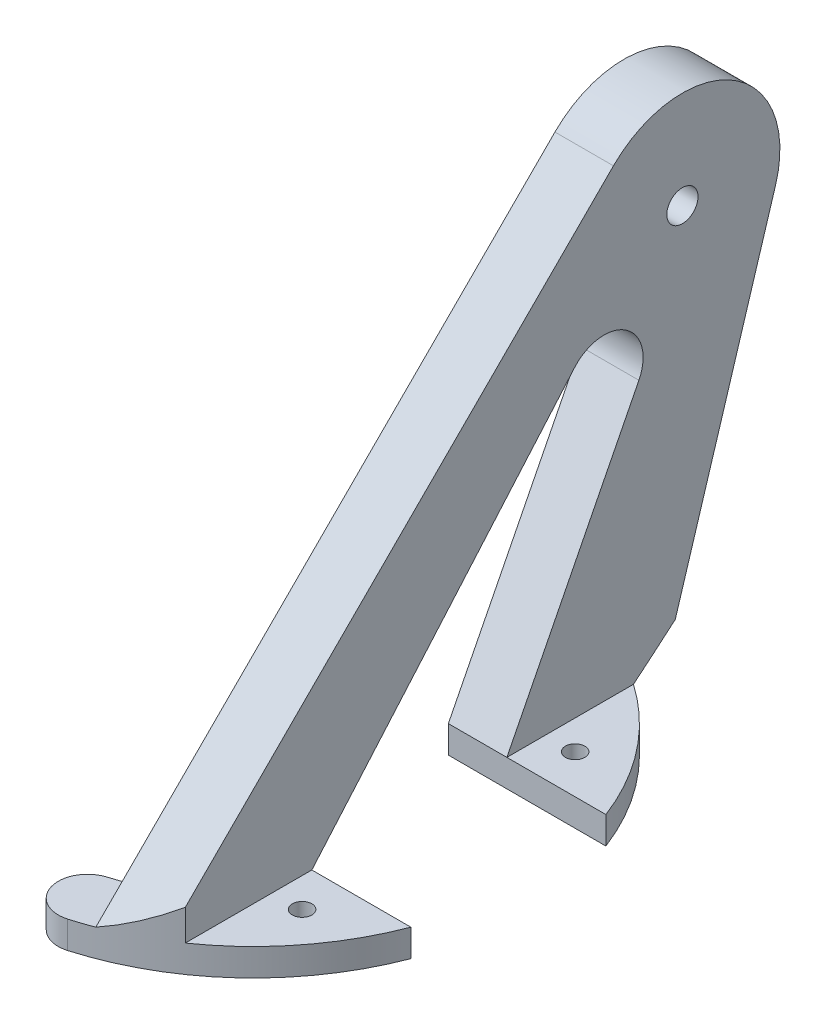
ISO-10303-21;
HEADER;
FILE_DESCRIPTION(('STEP AP214'),'2;1');
FILE_NAME('part.step','',(''),(''),'','','');
FILE_SCHEMA(('AUTOMOTIVE_DESIGN { 1 0 10303 214 1 1 1 1 }'));
ENDSEC;
DATA;
#1=APPLICATION_CONTEXT('core data for automotive mechanical design processes');
#2=APPLICATION_PROTOCOL_DEFINITION('international standard','automotive_design',2000,#1);
#3=PRODUCT_CONTEXT('',#1,'mechanical');
#4=PRODUCT('Part','Part','',(#3));
#5=PRODUCT_RELATED_PRODUCT_CATEGORY('part','',(#4));
#6=PRODUCT_DEFINITION_FORMATION('','',#4);
#7=PRODUCT_DEFINITION_CONTEXT('part definition',#1,'design');
#8=PRODUCT_DEFINITION('design','',#6,#7);
#9=PRODUCT_DEFINITION_SHAPE('','',#8);
#10=(LENGTH_UNIT() NAMED_UNIT(*) SI_UNIT(.MILLI.,.METRE.));
#11=(NAMED_UNIT(*) PLANE_ANGLE_UNIT() SI_UNIT($,.RADIAN.));
#12=(NAMED_UNIT(*) SI_UNIT($,.STERADIAN.) SOLID_ANGLE_UNIT());
#13=UNCERTAINTY_MEASURE_WITH_UNIT(LENGTH_MEASURE(1.E-05),#10,'distance_accuracy_value','');
#14=(GEOMETRIC_REPRESENTATION_CONTEXT(3) GLOBAL_UNCERTAINTY_ASSIGNED_CONTEXT((#13)) GLOBAL_UNIT_ASSIGNED_CONTEXT((#10,
#11,#12)) REPRESENTATION_CONTEXT('',''));
#15=CARTESIAN_POINT('',(0.,0.,0.));
#16=DIRECTION('',(0.,0.,1.));
#17=DIRECTION('',(1.,0.,0.));
#18=AXIS2_PLACEMENT_3D('',#15,#16,#17);
#19=CARTESIAN_POINT('',(25.,-7.,0.));
#20=DIRECTION('',(-1.,0.,0.));
#21=DIRECTION('',(0.,0.,1.));
#22=AXIS2_PLACEMENT_3D('',#19,#20,#21);
#23=PLANE('',#22);
#24=CARTESIAN_POINT('',(25.,100.,-70.));
#25=DIRECTION('',(-1.,0.,0.));
#26=DIRECTION('',(0.,0.,1.));
#27=AXIS2_PLACEMENT_3D('',#24,#25,#26);
#28=CIRCLE('',#27,11.);
#29=CARTESIAN_POINT('',(25.,100.,-59.));
#30=VERTEX_POINT('',#29);
#31=EDGE_CURVE('E205',#30,#30,#28,.T.);
#32=ORIENTED_EDGE('',*,*,#31,.F.);
#33=EDGE_LOOP('',(#32));
#34=FACE_BOUND('',#33,.T.);
#35=DIRECTION('',(0.,0.,1.));
#36=VECTOR('',#35,1.);
#37=CARTESIAN_POINT('',(25.,-7.,0.));
#38=LINE('',#37,#36);
#39=CARTESIAN_POINT('',(25.,-7.,25.));
#40=VERTEX_POINT('',#39);
#41=CARTESIAN_POINT('',(25.,-7.,48.9897948556636));
#42=VERTEX_POINT('',#41);
#43=EDGE_CURVE('E68',#40,#42,#38,.T.);
#44=ORIENTED_EDGE('',*,*,#43,.T.);
#45=DIRECTION('',(0.,1.,0.));
#46=VECTOR('',#45,1.);
#47=CARTESIAN_POINT('',(25.,-7.,48.9897948556636));
#48=LINE('',#47,#46);
#49=CARTESIAN_POINT('',(25.,0.,48.9897948556636));
#50=VERTEX_POINT('',#49);
#51=EDGE_CURVE('E63',#42,#50,#48,.T.);
#52=ORIENTED_EDGE('',*,*,#51,.T.);
#53=DIRECTION('',(0.,0.,-1.));
#54=VECTOR('',#53,1.);
#55=CARTESIAN_POINT('',(25.,0.,0.));
#56=LINE('',#55,#54);
#57=CARTESIAN_POINT('',(25.,0.,65.3834841531101));
#58=VERTEX_POINT('',#57);
#59=EDGE_CURVE('E197',#58,#50,#56,.T.);
#60=ORIENTED_EDGE('',*,*,#59,.F.);
#61=DIRECTION('',(0.,0.707022227260877,-0.707191325002696));
#62=VECTOR('',#61,1.);
#63=CARTESIAN_POINT('',(25.,0.,65.3834841531101));
#64=LINE('',#63,#62);
#65=CARTESIAN_POINT('',(25.,117.679783125067,-52.3244443184781));
#66=VERTEX_POINT('',#65);
#67=EDGE_CURVE('E294',#58,#66,#64,.T.);
#68=ORIENTED_EDGE('',*,*,#67,.T.);
#69=CARTESIAN_POINT('',(25.,100.,-70.));
#70=DIRECTION('',(-1.,0.,0.));
#71=DIRECTION('',(0.,0.,1.));
#72=AXIS2_PLACEMENT_3D('',#69,#70,#71);
#73=CIRCLE('',#72,25.);
#74=CARTESIAN_POINT('',(25.,92.6469210155402,-93.8941881939583));
#75=VERTEX_POINT('',#74);
#76=EDGE_CURVE('E298',#66,#75,#73,.T.);
#77=ORIENTED_EDGE('',*,*,#76,.T.);
#78=DIRECTION('',(0.,-0.955767527758332,0.294123159378391));
#79=VECTOR('',#78,1.);
#80=CARTESIAN_POINT('',(25.,0.,-65.3834841531101));
#81=LINE('',#80,#79);
#82=CARTESIAN_POINT('',(25.,-1.75207071073658E-13,-65.3834841531101));
#83=VERTEX_POINT('',#82);
#84=EDGE_CURVE('E260',#75,#83,#81,.T.);
#85=ORIENTED_EDGE('',*,*,#84,.T.);
#86=DIRECTION('',(0.,1.,0.));
#87=VECTOR('',#86,1.);
#88=CARTESIAN_POINT('',(25.,-7.,-65.3834841531101));
#89=LINE('',#88,#87);
#90=CARTESIAN_POINT('',(25.,-7.,-65.3834841531101));
#91=VERTEX_POINT('',#90);
#92=EDGE_CURVE('E345',#91,#83,#89,.T.);
#93=ORIENTED_EDGE('',*,*,#92,.F.);
#94=DIRECTION('',(0.,0.,1.));
#95=VECTOR('',#94,1.);
#96=CARTESIAN_POINT('',(25.,-7.,0.));
#97=LINE('',#96,#95);
#98=CARTESIAN_POINT('',(25.,-7.,-25.));
#99=VERTEX_POINT('',#98);
#100=EDGE_CURVE('E328',#91,#99,#97,.T.);
#101=ORIENTED_EDGE('',*,*,#100,.T.);
#102=DIRECTION('',(0.,1.,0.));
#103=VECTOR('',#102,1.);
#104=CARTESIAN_POINT('',(25.,-7.,-25.));
#105=LINE('',#104,#103);
#106=CARTESIAN_POINT('',(25.,0.,-25.));
#107=VERTEX_POINT('',#106);
#108=EDGE_CURVE('E340',#99,#107,#105,.T.);
#109=ORIENTED_EDGE('',*,*,#108,.T.);
#110=DIRECTION('',(0.,0.892034824715251,-0.451966670779198));
#111=VECTOR('',#110,1.);
#112=CARTESIAN_POINT('',(25.,0.,-25.));
#113=LINE('',#112,#111);
#114=CARTESIAN_POINT('',(25.,66.8072160740416,-58.849166194436));
#115=VERTEX_POINT('',#114);
#116=EDGE_CURVE('E251',#107,#115,#113,.T.);
#117=ORIENTED_EDGE('',*,*,#116,.T.);
#118=CARTESIAN_POINT('',(25.,71.3268827818336,-49.9288179472835));
#119=DIRECTION('',(1.,0.,0.));
#120=DIRECTION('',(0.,0.,1.));
#121=AXIS2_PLACEMENT_3D('',#118,#119,#120);
#122=CIRCLE('',#121,9.99999999999999);
#123=CARTESIAN_POINT('',(25.,77.8694877769299,-42.3661253131657));
#124=VERTEX_POINT('',#123);
#125=EDGE_CURVE('E286',#115,#124,#122,.T.);
#126=ORIENTED_EDGE('',*,*,#125,.T.);
#127=DIRECTION('',(0.,-0.756269263411783,0.654260499509636));
#128=VECTOR('',#127,1.);
#129=CARTESIAN_POINT('',(25.,0.,25.));
#130=LINE('',#129,#128);
#131=CARTESIAN_POINT('',(25.,0.,25.));
#132=VERTEX_POINT('',#131);
#133=EDGE_CURVE('E290',#124,#132,#130,.T.);
#134=ORIENTED_EDGE('',*,*,#133,.T.);
#135=DIRECTION('',(0.,1.,0.));
#136=VECTOR('',#135,1.);
#137=CARTESIAN_POINT('',(25.,-7.,25.));
#138=LINE('',#137,#136);
#139=EDGE_CURVE('E247',#40,#132,#138,.T.);
#140=ORIENTED_EDGE('',*,*,#139,.F.);
#141=EDGE_LOOP('',(#44,#52,#60,#68,#77,#85,#93,#101,#109,#117,#126,#134,#140));
#142=FACE_BOUND('',#141,.T.);
#143=ADVANCED_FACE('F43',(#34,#142),#23,.T.);
#144=CARTESIAN_POINT('',(65.3834841531101,100.,-70.));
#145=DIRECTION('',(-1.,0.,0.));
#146=DIRECTION('',(0.,0.,1.));
#147=AXIS2_PLACEMENT_3D('',#144,#145,#146);
#148=CYLINDRICAL_SURFACE('',#147,4.00000000000001);
#149=CARTESIAN_POINT('',(40.,100.,-70.));
#150=DIRECTION('',(-1.,0.,0.));
#151=DIRECTION('',(0.,0.,1.));
#152=AXIS2_PLACEMENT_3D('',#149,#150,#151);
#153=CIRCLE('',#152,4.00000000000001);
#154=CARTESIAN_POINT('',(40.,100.,-66.));
#155=VERTEX_POINT('',#154);
#156=EDGE_CURVE('E228',#155,#155,#153,.T.);
#157=ORIENTED_EDGE('',*,*,#156,.F.);
#158=EDGE_LOOP('',(#157));
#159=FACE_BOUND('',#158,.T.);
#160=CARTESIAN_POINT('',(30.,100.,-70.));
#161=DIRECTION('',(-1.,0.,0.));
#162=DIRECTION('',(0.,0.,1.));
#163=AXIS2_PLACEMENT_3D('',#160,#161,#162);
#164=CIRCLE('',#163,4.00000000000001);
#165=CARTESIAN_POINT('',(30.,100.,-66.));
#166=VERTEX_POINT('',#165);
#167=EDGE_CURVE('E49',#166,#166,#164,.F.);
#168=ORIENTED_EDGE('',*,*,#167,.F.);
#169=EDGE_LOOP('',(#168));
#170=FACE_BOUND('',#169,.T.);
#171=ADVANCED_FACE('F375',(#159,#170),#148,.F.);
#172=CARTESIAN_POINT('',(40.,0.,-65.3834841531101));
#173=DIRECTION('',(0.,-0.294123159378391,-0.955767527758332));
#174=DIRECTION('',(0.,0.955767527758332,-0.294123159378391));
#175=AXIS2_PLACEMENT_3D('',#172,#173,#174);
#176=PLANE('',#175);
#177=DIRECTION('',(0.,-0.955767527758332,0.294123159378391));
#178=VECTOR('',#177,1.);
#179=CARTESIAN_POINT('',(40.,0.,-65.3834841531101));
#180=LINE('',#179,#178);
#181=CARTESIAN_POINT('',(40.,92.6469210155402,-93.8941881939583));
#182=VERTEX_POINT('',#181);
#183=CARTESIAN_POINT('',(40.,9.03312240627647,-68.1632924475153));
#184=VERTEX_POINT('',#183);
#185=EDGE_CURVE('E279',#182,#184,#180,.T.);
#186=ORIENTED_EDGE('',*,*,#185,.T.);
#187=CARTESIAN_POINT('',(40.,9.03312240627647,-68.1632924475153));
#188=CARTESIAN_POINT('',(39.3987699086919,8.61889922566565,-68.0358214600308));
#189=CARTESIAN_POINT('',(38.7949177006889,8.20816896502699,-67.9094253664172));
#190=CARTESIAN_POINT('',(37.5815302389742,7.39440143029424,-67.65900058072));
#191=CARTESIAN_POINT('',(36.9719947514653,6.99136447478207,-67.5349719866753));
#192=CARTESIAN_POINT('',(35.1358387636793,5.79592022739036,-67.1670919021444));
#193=CARTESIAN_POINT('',(33.9001407886153,5.01612176308195,-66.9271205897284));
#194=CARTESIAN_POINT('',(32.0283979672395,3.87877927593322,-66.5771204527704));
#195=CARTESIAN_POINT('',(31.4026346895246,3.5057233080642,-66.4623180591884));
#196=CARTESIAN_POINT('',(30.1438594298698,2.7709649856057,-66.2362071766729));
#197=CARTESIAN_POINT('',(29.5108476374584,2.40926233507971,-66.1248985966694));
#198=CARTESIAN_POINT('',(28.2363577982883,1.69799845965656,-65.9060177787766));
#199=CARTESIAN_POINT('',(27.5948704286521,1.34845246578285,-65.7984502280068));
#200=CARTESIAN_POINT('',(26.3036854183782,0.663358778792782,-65.5876228941254));
#201=CARTESIAN_POINT('',(25.653986947649,0.327812515951839,-65.4843635511596));
#202=CARTESIAN_POINT('',(25.,-2.71636636580298E-13,-65.38348415311));
#203=B_SPLINE_CURVE_WITH_KNOTS('',3,(#187,#188,#189,#190,#191,#192,#193,#194,#195,#196,#197,
#198,#199,#200,#201,#202),.UNSPECIFIED.,.F.,.F.,(4,2,2,2,2,2,2,4),(0.,2.22341819047516,
4.44692825444808,8.8882901313285,11.1007356438604,13.3131234386312,15.5281899782592,
17.7434822676495),.UNSPECIFIED.);
#204=EDGE_CURVE('E55',#184,#83,#203,.T.);
#205=ORIENTED_EDGE('',*,*,#204,.T.);
#206=ORIENTED_EDGE('',*,*,#84,.F.);
#207=DIRECTION('',(-1.,0.,0.));
#208=VECTOR('',#207,1.);
#209=CARTESIAN_POINT('',(40.,92.6469210155402,-93.8941881939583));
#210=LINE('',#209,#208);
#211=EDGE_CURVE('E304',#182,#75,#210,.T.);
#212=ORIENTED_EDGE('',*,*,#211,.F.);
#213=EDGE_LOOP('',(#186,#205,#206,#212));
#214=FACE_BOUND('',#213,.T.);
#215=ADVANCED_FACE('F370',(#214),#176,.T.);
#216=CARTESIAN_POINT('',(40.,0.,65.3834841531101));
#217=DIRECTION('',(0.,0.707191325002696,0.707022227260877));
#218=DIRECTION('',(0.,-0.707022227260877,0.707191325002696));
#219=AXIS2_PLACEMENT_3D('',#216,#217,#218);
#220=PLANE('',#219);
#221=CARTESIAN_POINT('',(0.,65.3678501950402,0.));
#222=DIRECTION('',(0.,0.707191325002696,0.707022227260877));
#223=DIRECTION('',(0.,-0.707022227260877,0.707191325002696));
#224=AXIS2_PLACEMENT_3D('',#221,#222,#223);
#225=ELLIPSE('',#224,98.9831146468506,70.);
#226=CARTESIAN_POINT('',(40.,7.93595965283823,57.4456264653803));
#227=VERTEX_POINT('',#226);
#228=EDGE_CURVE('E227',#227,#58,#225,.F.);
#229=ORIENTED_EDGE('',*,*,#228,.F.);
#230=DIRECTION('',(0.,0.707022227260877,-0.707191325002696));
#231=VECTOR('',#230,1.);
#232=CARTESIAN_POINT('',(40.,0.,65.3834841531101));
#233=LINE('',#232,#231);
#234=CARTESIAN_POINT('',(40.,117.679783125067,-52.3244443184781));
#235=VERTEX_POINT('',#234);
#236=EDGE_CURVE('E272',#227,#235,#233,.T.);
#237=ORIENTED_EDGE('',*,*,#236,.T.);
#238=DIRECTION('',(-1.,0.,0.));
#239=VECTOR('',#238,1.);
#240=CARTESIAN_POINT('',(40.,117.679783125067,-52.3244443184781));
#241=LINE('',#240,#239);
#242=EDGE_CURVE('E308',#235,#66,#241,.T.);
#243=ORIENTED_EDGE('',*,*,#242,.T.);
#244=ORIENTED_EDGE('',*,*,#67,.F.);
#245=EDGE_LOOP('',(#229,#237,#243,#244));
#246=FACE_BOUND('',#245,.T.);
#247=ADVANCED_FACE('F374',(#246),#220,.T.);
#248=CARTESIAN_POINT('',(0.,0.,0.));
#249=DIRECTION('',(0.,1.,0.));
#250=DIRECTION('',(0.,0.,1.));
#251=AXIS2_PLACEMENT_3D('',#248,#249,#250);
#252=PLANE('',#251);
#253=CARTESIAN_POINT('',(47.5,0.,-35.));
#254=DIRECTION('',(0.,1.,0.));
#255=DIRECTION('',(0.,0.,1.));
#256=AXIS2_PLACEMENT_3D('',#253,#254,#255);
#257=CIRCLE('',#256,2.5);
#258=CARTESIAN_POINT('',(47.5,0.,-32.5));
#259=VERTEX_POINT('',#258);
#260=EDGE_CURVE('E206',#259,#259,#257,.T.);
#261=ORIENTED_EDGE('',*,*,#260,.F.);
#262=EDGE_LOOP('',(#261));
#263=FACE_BOUND('',#262,.T.);
#264=CARTESIAN_POINT('',(0.,0.,0.));
#265=DIRECTION('',(0.,1.,0.));
#266=DIRECTION('',(0.,0.,1.));
#267=AXIS2_PLACEMENT_3D('',#264,#265,#266);
#268=CIRCLE('',#267,70.);
#269=CARTESIAN_POINT('',(65.3834841531101,0.,-25.));
#270=VERTEX_POINT('',#269);
#271=CARTESIAN_POINT('',(40.,0.,-57.4456264653803));
#272=VERTEX_POINT('',#271);
#273=EDGE_CURVE('E324',#270,#272,#268,.T.);
#274=ORIENTED_EDGE('',*,*,#273,.T.);
#275=DIRECTION('',(0.,0.,1.));
#276=VECTOR('',#275,1.);
#277=CARTESIAN_POINT('',(40.,0.,0.));
#278=LINE('',#277,#276);
#279=CARTESIAN_POINT('',(40.,0.,-25.));
#280=VERTEX_POINT('',#279);
#281=EDGE_CURVE('E344',#272,#280,#278,.T.);
#282=ORIENTED_EDGE('',*,*,#281,.T.);
#283=DIRECTION('',(1.,0.,0.));
#284=VECTOR('',#283,1.);
#285=CARTESIAN_POINT('',(0.,0.,-25.));
#286=LINE('',#285,#284);
#287=EDGE_CURVE('E307',#280,#270,#286,.T.);
#288=ORIENTED_EDGE('',*,*,#287,.T.);
#289=EDGE_LOOP('',(#274,#282,#288));
#290=FACE_BOUND('',#289,.T.);
#291=ADVANCED_FACE('F388',(#263,#290),#252,.T.);
#292=CARTESIAN_POINT('',(0.,-7.,-25.));
#293=DIRECTION('',(0.,0.,1.));
#294=DIRECTION('',(1.,0.,0.));
#295=AXIS2_PLACEMENT_3D('',#292,#293,#294);
#296=PLANE('',#295);
#297=EDGE_CURVE('E333',#107,#280,#286,.T.);
#298=ORIENTED_EDGE('',*,*,#297,.F.);
#299=ORIENTED_EDGE('',*,*,#108,.F.);
#300=DIRECTION('',(1.,0.,0.));
#301=VECTOR('',#300,1.);
#302=CARTESIAN_POINT('',(0.,-7.,-25.));
#303=LINE('',#302,#301);
#304=CARTESIAN_POINT('',(65.3834841531101,-7.,-25.));
#305=VERTEX_POINT('',#304);
#306=EDGE_CURVE('E319',#99,#305,#303,.T.);
#307=ORIENTED_EDGE('',*,*,#306,.T.);
#308=DIRECTION('',(0.,1.,0.));
#309=VECTOR('',#308,1.);
#310=CARTESIAN_POINT('',(65.3834841531101,-7.,-25.));
#311=LINE('',#310,#309);
#312=EDGE_CURVE('E332',#305,#270,#311,.T.);
#313=ORIENTED_EDGE('',*,*,#312,.T.);
#314=ORIENTED_EDGE('',*,*,#287,.F.);
#315=EDGE_LOOP('',(#298,#299,#307,#313,#314));
#316=FACE_BOUND('',#315,.T.);
#317=ADVANCED_FACE('F407',(#316),#296,.T.);
#318=CARTESIAN_POINT('',(0.,-7.,0.));
#319=DIRECTION('',(0.,1.,0.));
#320=DIRECTION('',(0.,0.,1.));
#321=AXIS2_PLACEMENT_3D('',#318,#319,#320);
#322=CYLINDRICAL_SURFACE('',#321,70.);
#323=ORIENTED_EDGE('',*,*,#92,.T.);
#324=CARTESIAN_POINT('',(0.,-1.75207071073658E-13,0.));
#325=DIRECTION('',(0.,1.,0.));
#326=DIRECTION('',(0.,0.,1.));
#327=AXIS2_PLACEMENT_3D('',#324,#325,#326);
#328=CIRCLE('',#327,70.);
#329=EDGE_CURVE('E354',#83,#272,#328,.F.);
#330=ORIENTED_EDGE('',*,*,#329,.T.);
#331=ORIENTED_EDGE('',*,*,#273,.F.);
#332=ORIENTED_EDGE('',*,*,#312,.F.);
#333=CARTESIAN_POINT('',(0.,-7.,0.));
#334=DIRECTION('',(0.,1.,0.));
#335=DIRECTION('',(0.,0.,1.));
#336=AXIS2_PLACEMENT_3D('',#333,#334,#335);
#337=CIRCLE('',#336,70.);
#338=EDGE_CURVE('E323',#305,#91,#337,.T.);
#339=ORIENTED_EDGE('',*,*,#338,.T.);
#340=EDGE_LOOP('',(#323,#330,#331,#332,#339));
#341=FACE_BOUND('',#340,.T.);
#342=ADVANCED_FACE('F403',(#341),#322,.T.);
#343=CARTESIAN_POINT('',(0.,-7.,0.));
#344=DIRECTION('',(0.,1.,0.));
#345=DIRECTION('',(0.,0.,1.));
#346=AXIS2_PLACEMENT_3D('',#343,#344,#345);
#347=PLANE('',#346);
#348=CARTESIAN_POINT('',(47.5,-7.,-35.));
#349=DIRECTION('',(0.,1.,0.));
#350=DIRECTION('',(0.,0.,1.));
#351=AXIS2_PLACEMENT_3D('',#348,#349,#350);
#352=CIRCLE('',#351,2.5);
#353=CARTESIAN_POINT('',(47.5,-7.,-32.5));
#354=VERTEX_POINT('',#353);
#355=EDGE_CURVE('E201',#354,#354,#352,.T.);
#356=ORIENTED_EDGE('',*,*,#355,.T.);
#357=EDGE_LOOP('',(#356));
#358=FACE_BOUND('',#357,.T.);
#359=ORIENTED_EDGE('',*,*,#306,.F.);
#360=ORIENTED_EDGE('',*,*,#100,.F.);
#361=ORIENTED_EDGE('',*,*,#338,.F.);
#362=EDGE_LOOP('',(#359,#360,#361));
#363=FACE_BOUND('',#362,.T.);
#364=ADVANCED_FACE('F384',(#358,#363),#347,.F.);
#365=CARTESIAN_POINT('',(40.,100.,-70.));
#366=DIRECTION('',(-1.,0.,0.));
#367=DIRECTION('',(0.,0.,1.));
#368=AXIS2_PLACEMENT_3D('',#365,#366,#367);
#369=CYLINDRICAL_SURFACE('',#368,25.);
#370=ORIENTED_EDGE('',*,*,#76,.F.);
#371=ORIENTED_EDGE('',*,*,#242,.F.);
#372=CARTESIAN_POINT('',(40.,100.,-70.));
#373=DIRECTION('',(-1.,0.,0.));
#374=DIRECTION('',(0.,0.,1.));
#375=AXIS2_PLACEMENT_3D('',#372,#373,#374);
#376=CIRCLE('',#375,25.);
#377=EDGE_CURVE('E275',#235,#182,#376,.T.);
#378=ORIENTED_EDGE('',*,*,#377,.T.);
#379=ORIENTED_EDGE('',*,*,#211,.T.);
#380=EDGE_LOOP('',(#370,#371,#378,#379));
#381=FACE_BOUND('',#380,.T.);
#382=ADVANCED_FACE('F380',(#381),#369,.T.);
#383=CARTESIAN_POINT('',(40.,0.,25.));
#384=DIRECTION('',(0.,-0.654260499509636,-0.756269263411783));
#385=DIRECTION('',(0.,0.756269263411783,-0.654260499509636));
#386=AXIS2_PLACEMENT_3D('',#383,#384,#385);
#387=PLANE('',#386);
#388=ORIENTED_EDGE('',*,*,#133,.F.);
#389=DIRECTION('',(-1.,0.,0.));
#390=VECTOR('',#389,1.);
#391=CARTESIAN_POINT('',(40.,77.8694877769299,-42.3661253131657));
#392=LINE('',#391,#390);
#393=CARTESIAN_POINT('',(40.,77.8694877769299,-42.3661253131657));
#394=VERTEX_POINT('',#393);
#395=EDGE_CURVE('E314',#394,#124,#392,.T.);
#396=ORIENTED_EDGE('',*,*,#395,.F.);
#397=DIRECTION('',(0.,-0.756269263411783,0.654260499509636));
#398=VECTOR('',#397,1.);
#399=CARTESIAN_POINT('',(40.,0.,25.));
#400=LINE('',#399,#398);
#401=CARTESIAN_POINT('',(40.,0.,25.));
#402=VERTEX_POINT('',#401);
#403=EDGE_CURVE('E264',#394,#402,#400,.T.);
#404=ORIENTED_EDGE('',*,*,#403,.T.);
#405=DIRECTION('',(-1.,0.,0.));
#406=VECTOR('',#405,1.);
#407=CARTESIAN_POINT('',(40.,0.,25.));
#408=LINE('',#407,#406);
#409=EDGE_CURVE('E311',#402,#132,#408,.T.);
#410=ORIENTED_EDGE('',*,*,#409,.T.);
#411=EDGE_LOOP('',(#388,#396,#404,#410));
#412=FACE_BOUND('',#411,.T.);
#413=ADVANCED_FACE('F383',(#412),#387,.T.);
#414=CARTESIAN_POINT('',(40.,71.3268827818336,-49.9288179472835));
#415=DIRECTION('',(-1.,0.,0.));
#416=DIRECTION('',(0.,0.,1.));
#417=AXIS2_PLACEMENT_3D('',#414,#415,#416);
#418=CYLINDRICAL_SURFACE('',#417,9.99999999999999);
#419=ORIENTED_EDGE('',*,*,#125,.F.);
#420=DIRECTION('',(-1.,0.,0.));
#421=VECTOR('',#420,1.);
#422=CARTESIAN_POINT('',(40.,66.8072160740416,-58.849166194436));
#423=LINE('',#422,#421);
#424=CARTESIAN_POINT('',(40.,66.8072160740416,-58.849166194436));
#425=VERTEX_POINT('',#424);
#426=EDGE_CURVE('E282',#425,#115,#423,.T.);
#427=ORIENTED_EDGE('',*,*,#426,.F.);
#428=CARTESIAN_POINT('',(40.,71.3268827818336,-49.9288179472835));
#429=DIRECTION('',(1.,0.,0.));
#430=DIRECTION('',(0.,0.,1.));
#431=AXIS2_PLACEMENT_3D('',#428,#429,#430);
#432=CIRCLE('',#431,9.99999999999999);
#433=EDGE_CURVE('E259',#425,#394,#432,.T.);
#434=ORIENTED_EDGE('',*,*,#433,.T.);
#435=ORIENTED_EDGE('',*,*,#395,.T.);
#436=EDGE_LOOP('',(#419,#427,#434,#435));
#437=FACE_BOUND('',#436,.T.);
#438=ADVANCED_FACE('F392',(#437),#418,.F.);
#439=CARTESIAN_POINT('',(40.,0.,-25.));
#440=DIRECTION('',(0.,0.451966670779198,0.892034824715251));
#441=DIRECTION('',(0.,-0.892034824715251,0.451966670779198));
#442=AXIS2_PLACEMENT_3D('',#439,#440,#441);
#443=PLANE('',#442);
#444=ORIENTED_EDGE('',*,*,#116,.F.);
#445=ORIENTED_EDGE('',*,*,#297,.T.);
#446=DIRECTION('',(0.,0.892034824715251,-0.451966670779198));
#447=VECTOR('',#446,1.);
#448=CARTESIAN_POINT('',(40.,0.,-25.));
#449=LINE('',#448,#447);
#450=EDGE_CURVE('E255',#280,#425,#449,.T.);
#451=ORIENTED_EDGE('',*,*,#450,.T.);
#452=ORIENTED_EDGE('',*,*,#426,.T.);
#453=EDGE_LOOP('',(#444,#445,#451,#452));
#454=FACE_BOUND('',#453,.T.);
#455=ADVANCED_FACE('F396',(#454),#443,.T.);
#456=CARTESIAN_POINT('',(40.,71.3268827818336,-49.9288179472835));
#457=DIRECTION('',(-1.,0.,0.));
#458=DIRECTION('',(0.,0.,1.));
#459=AXIS2_PLACEMENT_3D('',#456,#457,#458);
#460=PLANE('',#459);
#461=ORIENTED_EDGE('',*,*,#156,.T.);
#462=EDGE_LOOP('',(#461));
#463=FACE_BOUND('',#462,.T.);
#464=ORIENTED_EDGE('',*,*,#281,.F.);
#465=CARTESIAN_POINT('',(40.,-1.75207071073658E-13,-57.4456264653803));
#466=CARTESIAN_POINT('',(40.,0.741043226415844,-58.3485861257324));
#467=CARTESIAN_POINT('',(40.,1.48545811489192,-59.2487707124287));
#468=CARTESIAN_POINT('',(40.,2.98032925831417,-61.0440541857367));
#469=CARTESIAN_POINT('',(40.,3.73078528772367,-61.9391532600995));
#470=CARTESIAN_POINT('',(40.,5.23708706113312,-63.724791418344));
#471=CARTESIAN_POINT('',(40.,5.9929327702396,-64.6153305316835));
#472=CARTESIAN_POINT('',(40.,7.50950711589101,-66.3922992136578));
#473=CARTESIAN_POINT('',(40.,8.27023593274875,-67.2787286284325));
#474=CARTESIAN_POINT('',(40.,9.03312240627647,-68.1632924475153));
#475=B_SPLINE_CURVE_WITH_KNOTS('',3,(#465,#466,#467,#468,#469,#470,#471,#472,#473,#474),
.UNSPECIFIED.,.F.,.F.,(4,2,2,2,4),(0.,3.50431323697882,7.00849624703621,10.5126565911242,
14.0169470822674),.UNSPECIFIED.);
#476=EDGE_CURVE('E11',#272,#184,#475,.T.);
#477=ORIENTED_EDGE('',*,*,#476,.T.);
#478=ORIENTED_EDGE('',*,*,#185,.F.);
#479=ORIENTED_EDGE('',*,*,#377,.F.);
#480=ORIENTED_EDGE('',*,*,#236,.F.);
#481=DIRECTION('',(0.,-1.,0.));
#482=VECTOR('',#481,1.);
#483=CARTESIAN_POINT('',(40.,10.,57.4456264653803));
#484=LINE('',#483,#482);
#485=CARTESIAN_POINT('',(40.,0.,57.4456264653803));
#486=VERTEX_POINT('',#485);
#487=EDGE_CURVE('E224',#227,#486,#484,.T.);
#488=ORIENTED_EDGE('',*,*,#487,.T.);
#489=DIRECTION('',(0.,0.,1.));
#490=VECTOR('',#489,1.);
#491=CARTESIAN_POINT('',(40.,0.,25.));
#492=LINE('',#491,#490);
#493=EDGE_CURVE('E268',#402,#486,#492,.T.);
#494=ORIENTED_EDGE('',*,*,#493,.F.);
#495=ORIENTED_EDGE('',*,*,#403,.F.);
#496=ORIENTED_EDGE('',*,*,#433,.F.);
#497=ORIENTED_EDGE('',*,*,#450,.F.);
#498=EDGE_LOOP('',(#464,#477,#478,#479,#480,#488,#494,#495,#496,#497));
#499=FACE_BOUND('',#498,.T.);
#500=ADVANCED_FACE('F377',(#463,#499),#460,.F.);
#501=CARTESIAN_POINT('',(0.,0.,0.));
#502=DIRECTION('',(0.,1.,0.));
#503=DIRECTION('',(0.,0.,1.));
#504=AXIS2_PLACEMENT_3D('',#501,#502,#503);
#505=PLANE('',#504);
#506=CARTESIAN_POINT('',(47.5,0.,35.));
#507=DIRECTION('',(0.,1.,0.));
#508=DIRECTION('',(0.,0.,1.));
#509=AXIS2_PLACEMENT_3D('',#506,#507,#508);
#510=CIRCLE('',#509,2.5);
#511=CARTESIAN_POINT('',(47.5,0.,37.5));
#512=VERTEX_POINT('',#511);
#513=EDGE_CURVE('E200',#512,#512,#510,.T.);
#514=ORIENTED_EDGE('',*,*,#513,.F.);
#515=EDGE_LOOP('',(#514));
#516=FACE_BOUND('',#515,.T.);
#517=ORIENTED_EDGE('',*,*,#493,.T.);
#518=CARTESIAN_POINT('',(0.,0.,0.));
#519=DIRECTION('',(0.,1.,0.));
#520=DIRECTION('',(0.,0.,1.));
#521=AXIS2_PLACEMENT_3D('',#518,#519,#520);
#522=CIRCLE('',#521,70.);
#523=CARTESIAN_POINT('',(65.3834841531101,0.,25.));
#524=VERTEX_POINT('',#523);
#525=EDGE_CURVE('E232',#486,#524,#522,.T.);
#526=ORIENTED_EDGE('',*,*,#525,.T.);
#527=DIRECTION('',(1.,0.,0.));
#528=VECTOR('',#527,1.);
#529=CARTESIAN_POINT('',(0.,0.,25.));
#530=LINE('',#529,#528);
#531=EDGE_CURVE('E235',#402,#524,#530,.T.);
#532=ORIENTED_EDGE('',*,*,#531,.F.);
#533=EDGE_LOOP('',(#517,#526,#532));
#534=FACE_BOUND('',#533,.T.);
#535=ADVANCED_FACE('F455',(#516,#534),#505,.T.);
#536=CARTESIAN_POINT('',(0.,-7.,25.));
#537=DIRECTION('',(0.,0.,1.));
#538=DIRECTION('',(1.,0.,0.));
#539=AXIS2_PLACEMENT_3D('',#536,#537,#538);
#540=PLANE('',#539);
#541=ORIENTED_EDGE('',*,*,#409,.F.);
#542=ORIENTED_EDGE('',*,*,#531,.T.);
#543=DIRECTION('',(0.,1.,0.));
#544=VECTOR('',#543,1.);
#545=CARTESIAN_POINT('',(65.3834841531101,-7.,25.));
#546=LINE('',#545,#544);
#547=CARTESIAN_POINT('',(65.3834841531101,-7.,25.));
#548=VERTEX_POINT('',#547);
#549=EDGE_CURVE('E241',#548,#524,#546,.T.);
#550=ORIENTED_EDGE('',*,*,#549,.F.);
#551=DIRECTION('',(1.,0.,0.));
#552=VECTOR('',#551,1.);
#553=CARTESIAN_POINT('',(0.,-7.,25.));
#554=LINE('',#553,#552);
#555=EDGE_CURVE('E238',#40,#548,#554,.T.);
#556=ORIENTED_EDGE('',*,*,#555,.F.);
#557=ORIENTED_EDGE('',*,*,#139,.T.);
#558=EDGE_LOOP('',(#541,#542,#550,#556,#557));
#559=FACE_BOUND('',#558,.T.);
#560=ADVANCED_FACE('F429',(#559),#540,.F.);
#561=CARTESIAN_POINT('',(0.,-7.,0.));
#562=DIRECTION('',(0.,1.,0.));
#563=DIRECTION('',(0.,0.,1.));
#564=AXIS2_PLACEMENT_3D('',#561,#562,#563);
#565=CYLINDRICAL_SURFACE('',#564,70.);
#566=ORIENTED_EDGE('',*,*,#525,.F.);
#567=ORIENTED_EDGE('',*,*,#487,.F.);
#568=ORIENTED_EDGE('',*,*,#228,.T.);
#569=CARTESIAN_POINT('',(0.,0.,0.));
#570=DIRECTION('',(0.,1.,0.));
#571=DIRECTION('',(0.,0.,1.));
#572=AXIS2_PLACEMENT_3D('',#569,#570,#571);
#573=CIRCLE('',#572,70.);
#574=CARTESIAN_POINT('',(19.6,0.,67.2));
#575=VERTEX_POINT('',#574);
#576=EDGE_CURVE('E175',#575,#58,#573,.T.);
#577=ORIENTED_EDGE('',*,*,#576,.F.);
#578=DIRECTION('',(0.,1.,0.));
#579=VECTOR('',#578,1.);
#580=CARTESIAN_POINT('',(19.6,-7.,67.2));
#581=LINE('',#580,#579);
#582=CARTESIAN_POINT('',(19.6,-7.,67.2));
#583=VERTEX_POINT('',#582);
#584=EDGE_CURVE('E168',#583,#575,#581,.T.);
#585=ORIENTED_EDGE('',*,*,#584,.F.);
#586=CARTESIAN_POINT('',(0.,-7.,0.));
#587=DIRECTION('',(0.,1.,0.));
#588=DIRECTION('',(0.,0.,1.));
#589=AXIS2_PLACEMENT_3D('',#586,#587,#588);
#590=CIRCLE('',#589,70.);
#591=EDGE_CURVE('E180',#583,#548,#590,.T.);
#592=ORIENTED_EDGE('',*,*,#591,.T.);
#593=ORIENTED_EDGE('',*,*,#549,.T.);
#594=EDGE_LOOP('',(#566,#567,#568,#577,#585,#592,#593));
#595=FACE_BOUND('',#594,.T.);
#596=ADVANCED_FACE('F434',(#595),#565,.T.);
#597=CARTESIAN_POINT('',(0.,-7.,0.));
#598=DIRECTION('',(0.,1.,0.));
#599=DIRECTION('',(0.,0.,1.));
#600=AXIS2_PLACEMENT_3D('',#597,#598,#599);
#601=PLANE('',#600);
#602=ORIENTED_EDGE('',*,*,#591,.F.);
#603=CARTESIAN_POINT('',(17.5,-7.,60.));
#604=DIRECTION('',(0.,1.,0.));
#605=DIRECTION('',(0.,0.,1.));
#606=AXIS2_PLACEMENT_3D('',#603,#604,#605);
#607=CIRCLE('',#606,7.50000000000001);
#608=CARTESIAN_POINT('',(15.4,-7.,52.8));
#609=VERTEX_POINT('',#608);
#610=EDGE_CURVE('E161',#609,#583,#607,.T.);
#611=ORIENTED_EDGE('',*,*,#610,.F.);
#612=CARTESIAN_POINT('',(0.,-7.,0.));
#613=DIRECTION('',(0.,1.,0.));
#614=DIRECTION('',(0.,0.,1.));
#615=AXIS2_PLACEMENT_3D('',#612,#613,#614);
#616=CIRCLE('',#615,55.);
#617=EDGE_CURVE('E171',#609,#42,#616,.T.);
#618=ORIENTED_EDGE('',*,*,#617,.T.);
#619=ORIENTED_EDGE('',*,*,#43,.F.);
#620=ORIENTED_EDGE('',*,*,#555,.T.);
#621=EDGE_LOOP('',(#602,#611,#618,#619,#620));
#622=FACE_BOUND('',#621,.T.);
#623=CARTESIAN_POINT('',(47.5,-7.,35.));
#624=DIRECTION('',(0.,1.,0.));
#625=DIRECTION('',(0.,0.,1.));
#626=AXIS2_PLACEMENT_3D('',#623,#624,#625);
#627=CIRCLE('',#626,2.5);
#628=CARTESIAN_POINT('',(47.5,-7.,37.5));
#629=VERTEX_POINT('',#628);
#630=EDGE_CURVE('E210',#629,#629,#627,.T.);
#631=ORIENTED_EDGE('',*,*,#630,.T.);
#632=EDGE_LOOP('',(#631));
#633=FACE_BOUND('',#632,.T.);
#634=ADVANCED_FACE('F177',(#622,#633),#601,.F.);
#635=CARTESIAN_POINT('',(0.,10.,0.));
#636=DIRECTION('',(0.,1.,0.));
#637=DIRECTION('',(0.,0.,1.));
#638=AXIS2_PLACEMENT_3D('',#635,#636,#637);
#639=CONICAL_SURFACE('',#638,80.0000000000001,0.785398163397443);
#640=ORIENTED_EDGE('',*,*,#476,.F.);
#641=ORIENTED_EDGE('',*,*,#329,.F.);
#642=ORIENTED_EDGE('',*,*,#204,.F.);
#643=EDGE_LOOP('',(#640,#641,#642));
#644=FACE_BOUND('',#643,.T.);
#645=ADVANCED_FACE('F46',(#644),#639,.T.);
#646=CARTESIAN_POINT('',(30.,100.,-70.));
#647=DIRECTION('',(-1.,0.,0.));
#648=DIRECTION('',(0.,0.,1.));
#649=AXIS2_PLACEMENT_3D('',#646,#647,#648);
#650=PLANE('',#649);
#651=CARTESIAN_POINT('',(30.,100.,-70.));
#652=DIRECTION('',(-1.,0.,0.));
#653=DIRECTION('',(0.,0.,1.));
#654=AXIS2_PLACEMENT_3D('',#651,#652,#653);
#655=CIRCLE('',#654,11.);
#656=CARTESIAN_POINT('',(30.,100.,-59.));
#657=VERTEX_POINT('',#656);
#658=EDGE_CURVE('E217',#657,#657,#655,.T.);
#659=ORIENTED_EDGE('',*,*,#658,.T.);
#660=EDGE_LOOP('',(#659));
#661=FACE_BOUND('',#660,.T.);
#662=ORIENTED_EDGE('',*,*,#167,.T.);
#663=EDGE_LOOP('',(#662));
#664=FACE_BOUND('',#663,.T.);
#665=ADVANCED_FACE('F477',(#661,#664),#650,.T.);
#666=CARTESIAN_POINT('',(30.,100.,-70.));
#667=DIRECTION('',(-1.,0.,0.));
#668=DIRECTION('',(0.,0.,1.));
#669=AXIS2_PLACEMENT_3D('',#666,#667,#668);
#670=CYLINDRICAL_SURFACE('',#669,11.);
#671=ORIENTED_EDGE('',*,*,#658,.F.);
#672=EDGE_LOOP('',(#671));
#673=FACE_BOUND('',#672,.T.);
#674=ORIENTED_EDGE('',*,*,#31,.T.);
#675=EDGE_LOOP('',(#674));
#676=FACE_BOUND('',#675,.T.);
#677=ADVANCED_FACE('F482',(#673,#676),#670,.F.);
#678=CARTESIAN_POINT('',(47.5,-7.,35.));
#679=DIRECTION('',(0.,1.,0.));
#680=DIRECTION('',(0.,0.,1.));
#681=AXIS2_PLACEMENT_3D('',#678,#679,#680);
#682=CYLINDRICAL_SURFACE('',#681,2.5);
#683=ORIENTED_EDGE('',*,*,#630,.F.);
#684=EDGE_LOOP('',(#683));
#685=FACE_BOUND('',#684,.T.);
#686=ORIENTED_EDGE('',*,*,#513,.T.);
#687=EDGE_LOOP('',(#686));
#688=FACE_BOUND('',#687,.T.);
#689=ADVANCED_FACE('F488',(#685,#688),#682,.F.);
#690=CARTESIAN_POINT('',(47.5,-7.,-35.));
#691=DIRECTION('',(0.,1.,0.));
#692=DIRECTION('',(0.,0.,1.));
#693=AXIS2_PLACEMENT_3D('',#690,#691,#692);
#694=CYLINDRICAL_SURFACE('',#693,2.5);
#695=ORIENTED_EDGE('',*,*,#355,.F.);
#696=EDGE_LOOP('',(#695));
#697=FACE_BOUND('',#696,.T.);
#698=ORIENTED_EDGE('',*,*,#260,.T.);
#699=EDGE_LOOP('',(#698));
#700=FACE_BOUND('',#699,.T.);
#701=ADVANCED_FACE('F545',(#697,#700),#694,.F.);
#702=CARTESIAN_POINT('',(0.,-7.,0.));
#703=DIRECTION('',(0.,1.,0.));
#704=DIRECTION('',(0.,0.,1.));
#705=AXIS2_PLACEMENT_3D('',#702,#703,#704);
#706=CYLINDRICAL_SURFACE('',#705,55.);
#707=ORIENTED_EDGE('',*,*,#51,.F.);
#708=ORIENTED_EDGE('',*,*,#617,.F.);
#709=DIRECTION('',(0.,1.,0.));
#710=VECTOR('',#709,1.);
#711=CARTESIAN_POINT('',(15.4,-7.,52.8));
#712=LINE('',#711,#710);
#713=CARTESIAN_POINT('',(15.4,0.,52.8));
#714=VERTEX_POINT('',#713);
#715=EDGE_CURVE('E157',#609,#714,#712,.T.);
#716=ORIENTED_EDGE('',*,*,#715,.T.);
#717=CARTESIAN_POINT('',(0.,0.,0.));
#718=DIRECTION('',(0.,1.,0.));
#719=DIRECTION('',(0.,0.,1.));
#720=AXIS2_PLACEMENT_3D('',#717,#718,#719);
#721=CIRCLE('',#720,55.);
#722=EDGE_CURVE('E185',#714,#50,#721,.T.);
#723=ORIENTED_EDGE('',*,*,#722,.T.);
#724=EDGE_LOOP('',(#707,#708,#716,#723));
#725=FACE_BOUND('',#724,.T.);
#726=ADVANCED_FACE('F172',(#725),#706,.F.);
#727=CARTESIAN_POINT('',(17.5,-7.,60.));
#728=DIRECTION('',(0.,1.,0.));
#729=DIRECTION('',(0.,0.,1.));
#730=AXIS2_PLACEMENT_3D('',#727,#728,#729);
#731=CYLINDRICAL_SURFACE('',#730,7.50000000000001);
#732=CARTESIAN_POINT('',(17.5,0.,60.));
#733=DIRECTION('',(0.,1.,0.));
#734=DIRECTION('',(0.,0.,1.));
#735=AXIS2_PLACEMENT_3D('',#732,#733,#734);
#736=CIRCLE('',#735,7.50000000000001);
#737=EDGE_CURVE('E163',#714,#575,#736,.T.);
#738=ORIENTED_EDGE('',*,*,#737,.F.);
#739=ORIENTED_EDGE('',*,*,#715,.F.);
#740=ORIENTED_EDGE('',*,*,#610,.T.);
#741=ORIENTED_EDGE('',*,*,#584,.T.);
#742=EDGE_LOOP('',(#738,#739,#740,#741));
#743=FACE_BOUND('',#742,.T.);
#744=ADVANCED_FACE('F159',(#743),#731,.T.);
#745=CARTESIAN_POINT('',(0.,0.,0.));
#746=DIRECTION('',(0.,1.,0.));
#747=DIRECTION('',(0.,0.,1.));
#748=AXIS2_PLACEMENT_3D('',#745,#746,#747);
#749=PLANE('',#748);
#750=ORIENTED_EDGE('',*,*,#576,.T.);
#751=ORIENTED_EDGE('',*,*,#59,.T.);
#752=ORIENTED_EDGE('',*,*,#722,.F.);
#753=ORIENTED_EDGE('',*,*,#737,.T.);
#754=EDGE_LOOP('',(#750,#751,#752,#753));
#755=FACE_BOUND('',#754,.T.);
#756=ADVANCED_FACE('F438',(#755),#749,.T.);
#757=CLOSED_SHELL('',(#143,#171,#215,#247,#291,#317,#342,#364,#382,#413,#438,#455,#500,#535,
#560,#596,#634,#645,#665,#677,#689,#701,#726,#744,#756));
#758=MANIFOLD_SOLID_BREP('B2',#757);
#759=ADVANCED_BREP_SHAPE_REPRESENTATION('',(#18,#758),#14);
#760=SHAPE_DEFINITION_REPRESENTATION(#9,#759);
ENDSEC;
END-ISO-10303-21;
